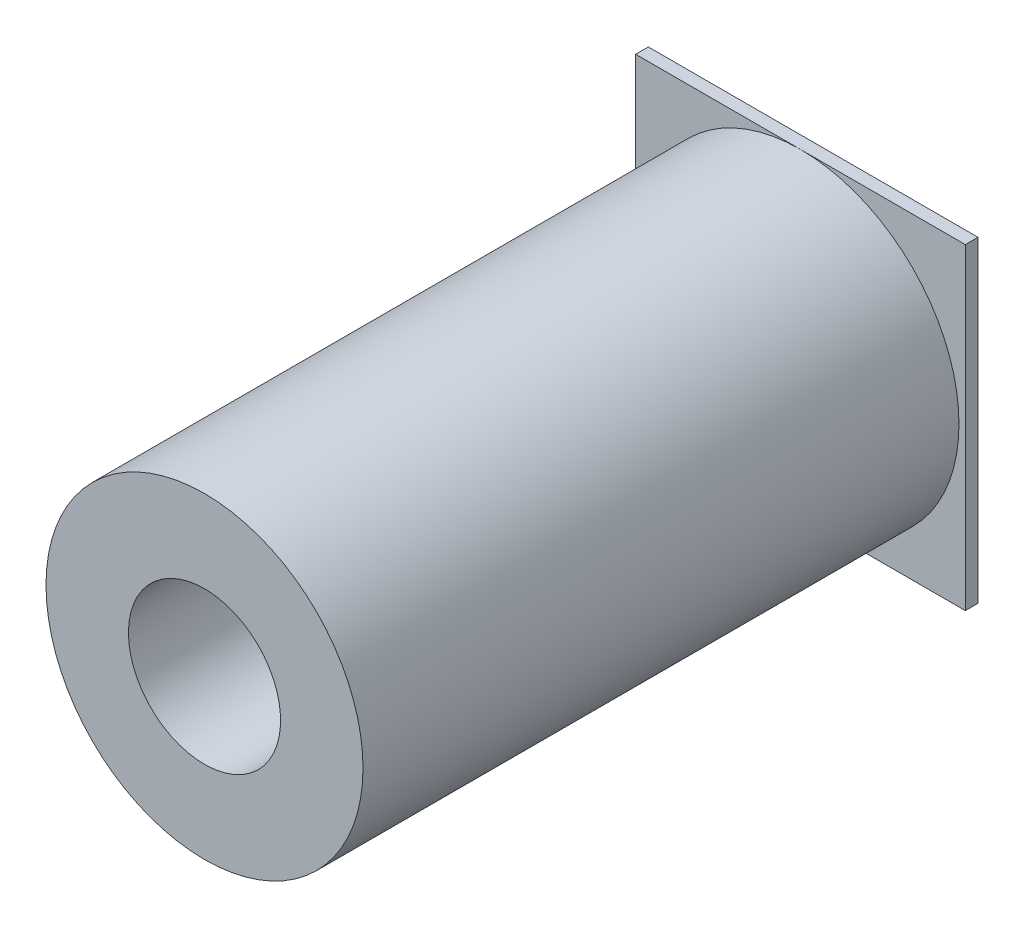
ISO-10303-21;
HEADER;
FILE_DESCRIPTION(('STEP AP214'),'2;1');
FILE_NAME('part.step','',(''),(''),'','','');
FILE_SCHEMA(('AUTOMOTIVE_DESIGN { 1 0 10303 214 1 1 1 1 }'));
ENDSEC;
DATA;
#1=APPLICATION_CONTEXT('core data for automotive mechanical design processes');
#2=APPLICATION_PROTOCOL_DEFINITION('international standard','automotive_design',2000,#1);
#3=PRODUCT_CONTEXT('',#1,'mechanical');
#4=PRODUCT('Part','Part','',(#3));
#5=PRODUCT_RELATED_PRODUCT_CATEGORY('part','',(#4));
#6=PRODUCT_DEFINITION_FORMATION('','',#4);
#7=PRODUCT_DEFINITION_CONTEXT('part definition',#1,'design');
#8=PRODUCT_DEFINITION('design','',#6,#7);
#9=PRODUCT_DEFINITION_SHAPE('','',#8);
#10=(LENGTH_UNIT() NAMED_UNIT(*) SI_UNIT(.MILLI.,.METRE.));
#11=(NAMED_UNIT(*) PLANE_ANGLE_UNIT() SI_UNIT($,.RADIAN.));
#12=(NAMED_UNIT(*) SI_UNIT($,.STERADIAN.) SOLID_ANGLE_UNIT());
#13=UNCERTAINTY_MEASURE_WITH_UNIT(LENGTH_MEASURE(1.E-05),#10,'distance_accuracy_value','');
#14=(GEOMETRIC_REPRESENTATION_CONTEXT(3) GLOBAL_UNCERTAINTY_ASSIGNED_CONTEXT((#13)) GLOBAL_UNIT_ASSIGNED_CONTEXT((#10,
#11,#12)) REPRESENTATION_CONTEXT('',''));
#15=CARTESIAN_POINT('',(0.,0.,0.));
#16=DIRECTION('',(0.,0.,1.));
#17=DIRECTION('',(1.,0.,0.));
#18=AXIS2_PLACEMENT_3D('',#15,#16,#17);
#19=CARTESIAN_POINT('',(0.,0.,1.));
#20=DIRECTION('',(0.,0.,1.));
#21=DIRECTION('',(1.,0.,0.));
#22=AXIS2_PLACEMENT_3D('',#19,#20,#21);
#23=PLANE('',#22);
#24=CARTESIAN_POINT('',(0.,0.,1.));
#25=DIRECTION('',(0.,0.,1.));
#26=DIRECTION('',(1.,0.,0.));
#27=AXIS2_PLACEMENT_3D('',#24,#25,#26);
#28=CIRCLE('',#27,12.5);
#29=CARTESIAN_POINT('',(0.,12.5,1.));
#30=VERTEX_POINT('',#29);
#31=CARTESIAN_POINT('',(0.,-12.5,1.));
#32=VERTEX_POINT('',#31);
#33=EDGE_CURVE('E53',#30,#32,#28,.T.);
#34=ORIENTED_EDGE('',*,*,#33,.F.);
#35=DIRECTION('',(-1.,0.,0.));
#36=VECTOR('',#35,1.);
#37=CARTESIAN_POINT('',(-13.,12.5,1.));
#38=LINE('',#37,#36);
#39=CARTESIAN_POINT('',(-13.,12.5,1.));
#40=VERTEX_POINT('',#39);
#41=EDGE_CURVE('E100',#30,#40,#38,.T.);
#42=ORIENTED_EDGE('',*,*,#41,.T.);
#43=DIRECTION('',(0.,-1.,0.));
#44=VECTOR('',#43,1.);
#45=CARTESIAN_POINT('',(-13.,12.5,1.));
#46=LINE('',#45,#44);
#47=CARTESIAN_POINT('',(-13.,-12.5,1.));
#48=VERTEX_POINT('',#47);
#49=EDGE_CURVE('E99',#40,#48,#46,.T.);
#50=ORIENTED_EDGE('',*,*,#49,.T.);
#51=DIRECTION('',(1.,0.,0.));
#52=VECTOR('',#51,1.);
#53=CARTESIAN_POINT('',(-13.,-12.5,1.));
#54=LINE('',#53,#52);
#55=EDGE_CURVE('E112',#48,#32,#54,.T.);
#56=ORIENTED_EDGE('',*,*,#55,.T.);
#57=EDGE_LOOP('',(#34,#42,#50,#56));
#58=FACE_BOUND('',#57,.T.);
#59=ADVANCED_FACE('F43',(#58),#23,.T.);
#60=CARTESIAN_POINT('',(13.,12.5,1.));
#61=DIRECTION('',(-1.,0.,0.));
#62=DIRECTION('',(0.,-1.,0.));
#63=AXIS2_PLACEMENT_3D('',#60,#61,#62);
#64=PLANE('',#63);
#65=DIRECTION('',(0.,1.,0.));
#66=VECTOR('',#65,1.);
#67=CARTESIAN_POINT('',(13.,12.5,0.));
#68=LINE('',#67,#66);
#69=CARTESIAN_POINT('',(13.,-12.5,0.));
#70=VERTEX_POINT('',#69);
#71=CARTESIAN_POINT('',(13.,12.5,0.));
#72=VERTEX_POINT('',#71);
#73=EDGE_CURVE('E242',#70,#72,#68,.T.);
#74=ORIENTED_EDGE('',*,*,#73,.T.);
#75=DIRECTION('',(0.,0.,-1.));
#76=VECTOR('',#75,1.);
#77=CARTESIAN_POINT('',(13.,12.5,1.));
#78=LINE('',#77,#76);
#79=CARTESIAN_POINT('',(13.,12.5,1.));
#80=VERTEX_POINT('',#79);
#81=EDGE_CURVE('E47',#80,#72,#78,.T.);
#82=ORIENTED_EDGE('',*,*,#81,.F.);
#83=DIRECTION('',(0.,1.,0.));
#84=VECTOR('',#83,1.);
#85=CARTESIAN_POINT('',(13.,12.5,1.));
#86=LINE('',#85,#84);
#87=CARTESIAN_POINT('',(13.,-12.5,1.));
#88=VERTEX_POINT('',#87);
#89=EDGE_CURVE('E97',#88,#80,#86,.T.);
#90=ORIENTED_EDGE('',*,*,#89,.F.);
#91=DIRECTION('',(0.,0.,-1.));
#92=VECTOR('',#91,1.);
#93=CARTESIAN_POINT('',(13.,-12.5,1.));
#94=LINE('',#93,#92);
#95=EDGE_CURVE('E247',#88,#70,#94,.T.);
#96=ORIENTED_EDGE('',*,*,#95,.T.);
#97=EDGE_LOOP('',(#74,#82,#90,#96));
#98=FACE_BOUND('',#97,.T.);
#99=ADVANCED_FACE('F45',(#98),#64,.F.);
#100=CARTESIAN_POINT('',(-13.,12.5,1.));
#101=DIRECTION('',(0.,-1.,0.));
#102=DIRECTION('',(0.,0.,-1.));
#103=AXIS2_PLACEMENT_3D('',#100,#101,#102);
#104=PLANE('',#103);
#105=DIRECTION('',(-1.,0.,0.));
#106=VECTOR('',#105,1.);
#107=CARTESIAN_POINT('',(-13.,12.5,0.));
#108=LINE('',#107,#106);
#109=CARTESIAN_POINT('',(-13.,12.5,0.));
#110=VERTEX_POINT('',#109);
#111=EDGE_CURVE('E250',#72,#110,#108,.T.);
#112=ORIENTED_EDGE('',*,*,#111,.T.);
#113=DIRECTION('',(0.,0.,-1.));
#114=VECTOR('',#113,1.);
#115=CARTESIAN_POINT('',(-13.,12.5,1.));
#116=LINE('',#115,#114);
#117=EDGE_CURVE('E106',#40,#110,#116,.T.);
#118=ORIENTED_EDGE('',*,*,#117,.F.);
#119=ORIENTED_EDGE('',*,*,#41,.F.);
#120=EDGE_CURVE('E92',#80,#30,#38,.T.);
#121=ORIENTED_EDGE('',*,*,#120,.F.);
#122=ORIENTED_EDGE('',*,*,#81,.T.);
#123=EDGE_LOOP('',(#112,#118,#119,#121,#122));
#124=FACE_BOUND('',#123,.T.);
#125=ADVANCED_FACE('F104',(#124),#104,.F.);
#126=CARTESIAN_POINT('',(-13.,12.5,1.));
#127=DIRECTION('',(1.,0.,0.));
#128=DIRECTION('',(0.,1.,0.));
#129=AXIS2_PLACEMENT_3D('',#126,#127,#128);
#130=PLANE('',#129);
#131=DIRECTION('',(0.,-1.,0.));
#132=VECTOR('',#131,1.);
#133=CARTESIAN_POINT('',(-13.,12.5,0.));
#134=LINE('',#133,#132);
#135=CARTESIAN_POINT('',(-13.,-12.5,0.));
#136=VERTEX_POINT('',#135);
#137=EDGE_CURVE('E252',#110,#136,#134,.T.);
#138=ORIENTED_EDGE('',*,*,#137,.T.);
#139=DIRECTION('',(0.,0.,-1.));
#140=VECTOR('',#139,1.);
#141=CARTESIAN_POINT('',(-13.,-12.5,1.));
#142=LINE('',#141,#140);
#143=EDGE_CURVE('E256',#48,#136,#142,.T.);
#144=ORIENTED_EDGE('',*,*,#143,.F.);
#145=ORIENTED_EDGE('',*,*,#49,.F.);
#146=ORIENTED_EDGE('',*,*,#117,.T.);
#147=EDGE_LOOP('',(#138,#144,#145,#146));
#148=FACE_BOUND('',#147,.T.);
#149=ADVANCED_FACE('F143',(#148),#130,.F.);
#150=CARTESIAN_POINT('',(-13.,-12.5,1.));
#151=DIRECTION('',(0.,1.,0.));
#152=DIRECTION('',(0.,0.,1.));
#153=AXIS2_PLACEMENT_3D('',#150,#151,#152);
#154=PLANE('',#153);
#155=DIRECTION('',(1.,0.,0.));
#156=VECTOR('',#155,1.);
#157=CARTESIAN_POINT('',(-13.,-12.5,0.));
#158=LINE('',#157,#156);
#159=EDGE_CURVE('E85',#136,#70,#158,.T.);
#160=ORIENTED_EDGE('',*,*,#159,.T.);
#161=ORIENTED_EDGE('',*,*,#95,.F.);
#162=EDGE_CURVE('E63',#32,#88,#54,.T.);
#163=ORIENTED_EDGE('',*,*,#162,.F.);
#164=ORIENTED_EDGE('',*,*,#55,.F.);
#165=ORIENTED_EDGE('',*,*,#143,.T.);
#166=EDGE_LOOP('',(#160,#161,#163,#164,#165));
#167=FACE_BOUND('',#166,.T.);
#168=ADVANCED_FACE('F139',(#167),#154,.F.);
#169=EDGE_CURVE('E11',#32,#30,#28,.T.);
#170=ORIENTED_EDGE('',*,*,#169,.F.);
#171=ORIENTED_EDGE('',*,*,#162,.T.);
#172=ORIENTED_EDGE('',*,*,#89,.T.);
#173=ORIENTED_EDGE('',*,*,#120,.T.);
#174=EDGE_LOOP('',(#170,#171,#172,#173));
#175=FACE_BOUND('',#174,.T.);
#176=ADVANCED_FACE('F95',(#175),#23,.T.);
#177=CARTESIAN_POINT('',(0.,0.,0.));
#178=DIRECTION('',(0.,0.,1.));
#179=DIRECTION('',(1.,0.,0.));
#180=AXIS2_PLACEMENT_3D('',#177,#178,#179);
#181=PLANE('',#180);
#182=CARTESIAN_POINT('',(0.,0.,0.));
#183=DIRECTION('',(0.,0.,-1.));
#184=DIRECTION('',(-1.,0.,0.));
#185=AXIS2_PLACEMENT_3D('',#182,#183,#184);
#186=CIRCLE('',#185,6.);
#187=CARTESIAN_POINT('',(-6.,0.,0.));
#188=VERTEX_POINT('',#187);
#189=EDGE_CURVE('E237',#188,#188,#186,.T.);
#190=ORIENTED_EDGE('',*,*,#189,.F.);
#191=EDGE_LOOP('',(#190));
#192=FACE_BOUND('',#191,.T.);
#193=ORIENTED_EDGE('',*,*,#73,.F.);
#194=ORIENTED_EDGE('',*,*,#159,.F.);
#195=ORIENTED_EDGE('',*,*,#137,.F.);
#196=ORIENTED_EDGE('',*,*,#111,.F.);
#197=EDGE_LOOP('',(#193,#194,#195,#196));
#198=FACE_BOUND('',#197,.T.);
#199=ADVANCED_FACE('F119',(#192,#198),#181,.F.);
#200=CARTESIAN_POINT('',(0.,0.,48.));
#201=DIRECTION('',(0.,0.,-1.));
#202=DIRECTION('',(-1.,0.,0.));
#203=AXIS2_PLACEMENT_3D('',#200,#201,#202);
#204=CYLINDRICAL_SURFACE('',#203,12.5);
#205=CARTESIAN_POINT('',(0.,0.,48.));
#206=DIRECTION('',(0.,0.,1.));
#207=DIRECTION('',(1.,0.,0.));
#208=AXIS2_PLACEMENT_3D('',#205,#206,#207);
#209=CIRCLE('',#208,12.5);
#210=CARTESIAN_POINT('',(12.5,0.,48.));
#211=VERTEX_POINT('',#210);
#212=EDGE_CURVE('E114',#211,#211,#209,.T.);
#213=ORIENTED_EDGE('',*,*,#212,.F.);
#214=EDGE_LOOP('',(#213));
#215=FACE_BOUND('',#214,.T.);
#216=ORIENTED_EDGE('',*,*,#33,.T.);
#217=ORIENTED_EDGE('',*,*,#169,.T.);
#218=EDGE_LOOP('',(#216,#217));
#219=FACE_BOUND('',#218,.T.);
#220=ADVANCED_FACE('F116',(#215,#219),#204,.T.);
#221=CARTESIAN_POINT('',(0.,0.,48.));
#222=DIRECTION('',(0.,0.,1.));
#223=DIRECTION('',(1.,0.,0.));
#224=AXIS2_PLACEMENT_3D('',#221,#222,#223);
#225=PLANE('',#224);
#226=CARTESIAN_POINT('',(0.,0.,48.));
#227=DIRECTION('',(0.,0.,-1.));
#228=DIRECTION('',(-1.,0.,0.));
#229=AXIS2_PLACEMENT_3D('',#226,#227,#228);
#230=CIRCLE('',#229,6.);
#231=CARTESIAN_POINT('',(-6.,0.,48.));
#232=VERTEX_POINT('',#231);
#233=EDGE_CURVE('E115',#232,#232,#230,.T.);
#234=ORIENTED_EDGE('',*,*,#233,.T.);
#235=EDGE_LOOP('',(#234));
#236=FACE_BOUND('',#235,.T.);
#237=ORIENTED_EDGE('',*,*,#212,.T.);
#238=EDGE_LOOP('',(#237));
#239=FACE_BOUND('',#238,.T.);
#240=ADVANCED_FACE('F118',(#236,#239),#225,.T.);
#241=CARTESIAN_POINT('',(0.,0.,48.));
#242=DIRECTION('',(0.,0.,-1.));
#243=DIRECTION('',(-1.,0.,0.));
#244=AXIS2_PLACEMENT_3D('',#241,#242,#243);
#245=CYLINDRICAL_SURFACE('',#244,6.);
#246=ORIENTED_EDGE('',*,*,#233,.F.);
#247=EDGE_LOOP('',(#246));
#248=FACE_BOUND('',#247,.T.);
#249=ORIENTED_EDGE('',*,*,#189,.T.);
#250=EDGE_LOOP('',(#249));
#251=FACE_BOUND('',#250,.T.);
#252=ADVANCED_FACE('F126',(#248,#251),#245,.F.);
#253=CLOSED_SHELL('',(#59,#99,#125,#149,#168,#176,#199,#220,#240,#252));
#254=MANIFOLD_SOLID_BREP('B2',#253);
#255=ADVANCED_BREP_SHAPE_REPRESENTATION('',(#18,#254),#14);
#256=SHAPE_DEFINITION_REPRESENTATION(#9,#255);
ENDSEC;
END-ISO-10303-21;
